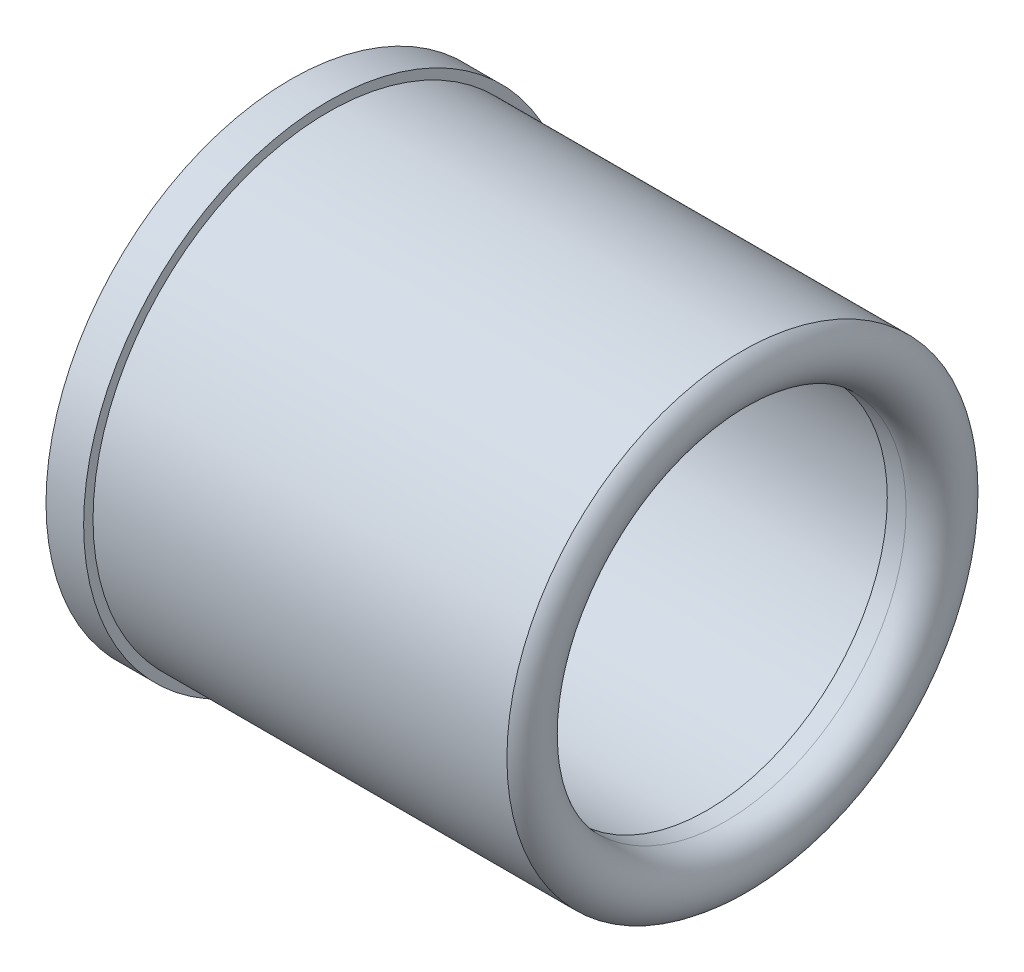
ISO-10303-21;
HEADER;
FILE_DESCRIPTION(('STEP AP214'),'2;1');
FILE_NAME('part.step','',(''),(''),'','','');
FILE_SCHEMA(('AUTOMOTIVE_DESIGN { 1 0 10303 214 1 1 1 1 }'));
ENDSEC;
DATA;
#1=APPLICATION_CONTEXT('core data for automotive mechanical design processes');
#2=APPLICATION_PROTOCOL_DEFINITION('international standard','automotive_design',2000,#1);
#3=PRODUCT_CONTEXT('',#1,'mechanical');
#4=PRODUCT('Part','Part','',(#3));
#5=PRODUCT_RELATED_PRODUCT_CATEGORY('part','',(#4));
#6=PRODUCT_DEFINITION_FORMATION('','',#4);
#7=PRODUCT_DEFINITION_CONTEXT('part definition',#1,'design');
#8=PRODUCT_DEFINITION('design','',#6,#7);
#9=PRODUCT_DEFINITION_SHAPE('','',#8);
#10=(LENGTH_UNIT() NAMED_UNIT(*) SI_UNIT(.MILLI.,.METRE.));
#11=(NAMED_UNIT(*) PLANE_ANGLE_UNIT() SI_UNIT($,.RADIAN.));
#12=(NAMED_UNIT(*) SI_UNIT($,.STERADIAN.) SOLID_ANGLE_UNIT());
#13=UNCERTAINTY_MEASURE_WITH_UNIT(LENGTH_MEASURE(1.E-05),#10,'distance_accuracy_value','');
#14=(GEOMETRIC_REPRESENTATION_CONTEXT(3) GLOBAL_UNCERTAINTY_ASSIGNED_CONTEXT((#13)) GLOBAL_UNIT_ASSIGNED_CONTEXT((#10,
#11,#12)) REPRESENTATION_CONTEXT('',''));
#15=CARTESIAN_POINT('',(0.,0.,0.));
#16=DIRECTION('',(0.,0.,1.));
#17=DIRECTION('',(1.,0.,0.));
#18=AXIS2_PLACEMENT_3D('',#15,#16,#17);
#19=CARTESIAN_POINT('',(12.1757416936097,-8.53326323507829,0.));
#20=DIRECTION('',(-1.,0.,0.));
#21=DIRECTION('',(0.,0.,1.));
#22=AXIS2_PLACEMENT_3D('',#19,#20,#21);
#23=CYLINDRICAL_SURFACE('',#22,4.8);
#24=CARTESIAN_POINT('',(11.9728126653829,-8.53326323507829,0.));
#25=DIRECTION('',(-1.,0.,0.));
#26=DIRECTION('',(0.,0.,1.));
#27=AXIS2_PLACEMENT_3D('',#24,#25,#26);
#28=CIRCLE('',#27,4.8);
#29=CARTESIAN_POINT('',(11.9728126653829,-8.53326323507829,4.8));
#30=VERTEX_POINT('',#29);
#31=EDGE_CURVE('E10',#30,#30,#28,.T.);
#32=ORIENTED_EDGE('',*,*,#31,.T.);
#33=EDGE_LOOP('',(#32));
#34=FACE_BOUND('',#33,.T.);
#35=CARTESIAN_POINT('',(12.4728126653829,-8.53326323507829,0.));
#36=DIRECTION('',(-1.,0.,0.));
#37=DIRECTION('',(0.,0.,1.));
#38=AXIS2_PLACEMENT_3D('',#35,#36,#37);
#39=CIRCLE('',#38,4.8);
#40=CARTESIAN_POINT('',(12.4728126653829,-8.53326323507829,4.8));
#41=VERTEX_POINT('',#40);
#42=EDGE_CURVE('E61',#41,#41,#39,.T.);
#43=ORIENTED_EDGE('',*,*,#42,.F.);
#44=EDGE_LOOP('',(#43));
#45=FACE_BOUND('',#44,.T.);
#46=ADVANCED_FACE('F33',(#34,#45),#23,.F.);
#47=CARTESIAN_POINT('',(11.9728126653829,-3.73326323507829,0.));
#48=DIRECTION('',(-1.,0.,0.));
#49=DIRECTION('',(0.,0.,1.));
#50=AXIS2_PLACEMENT_3D('',#47,#48,#49);
#51=PLANE('',#50);
#52=CARTESIAN_POINT('',(11.9728126653829,-8.53326323507829,0.));
#53=DIRECTION('',(-1.,0.,0.));
#54=DIRECTION('',(0.,0.,1.));
#55=AXIS2_PLACEMENT_3D('',#52,#53,#54);
#56=CIRCLE('',#55,5.05);
#57=CARTESIAN_POINT('',(11.9728126653829,-8.53326323507829,5.05));
#58=VERTEX_POINT('',#57);
#59=EDGE_CURVE('E39',#58,#58,#56,.T.);
#60=ORIENTED_EDGE('',*,*,#59,.T.);
#61=EDGE_LOOP('',(#60));
#62=FACE_BOUND('',#61,.T.);
#63=ORIENTED_EDGE('',*,*,#31,.F.);
#64=EDGE_LOOP('',(#63));
#65=FACE_BOUND('',#64,.T.);
#66=ADVANCED_FACE('F69',(#62,#65),#51,.T.);
#67=CARTESIAN_POINT('',(12.1757416936097,-8.53326323507829,0.));
#68=DIRECTION('',(-1.,0.,0.));
#69=DIRECTION('',(0.,0.,1.));
#70=AXIS2_PLACEMENT_3D('',#67,#68,#69);
#71=CYLINDRICAL_SURFACE('',#70,5.05);
#72=CARTESIAN_POINT('',(0.912123334161097,-8.53326323507829,0.));
#73=DIRECTION('',(-1.,0.,0.));
#74=DIRECTION('',(0.,0.,1.));
#75=AXIS2_PLACEMENT_3D('',#72,#73,#74);
#76=CIRCLE('',#75,5.05);
#77=CARTESIAN_POINT('',(0.912123334161097,-8.53326323507829,5.05));
#78=VERTEX_POINT('',#77);
#79=EDGE_CURVE('E43',#78,#78,#76,.T.);
#80=ORIENTED_EDGE('',*,*,#79,.T.);
#81=EDGE_LOOP('',(#80));
#82=FACE_BOUND('',#81,.T.);
#83=ORIENTED_EDGE('',*,*,#59,.F.);
#84=EDGE_LOOP('',(#83));
#85=FACE_BOUND('',#84,.T.);
#86=ADVANCED_FACE('F73',(#82,#85),#71,.F.);
#87=CARTESIAN_POINT('',(0.912123334161096,-3.48326323507829,0.));
#88=DIRECTION('',(-1.,0.,0.));
#89=DIRECTION('',(0.,0.,1.));
#90=AXIS2_PLACEMENT_3D('',#87,#88,#89);
#91=PLANE('',#90);
#92=CARTESIAN_POINT('',(0.912123334161097,-8.53326323507829,0.));
#93=DIRECTION('',(-1.,0.,0.));
#94=DIRECTION('',(0.,0.,1.));
#95=AXIS2_PLACEMENT_3D('',#92,#93,#94);
#96=CIRCLE('',#95,6.5);
#97=CARTESIAN_POINT('',(0.912123334161097,-8.53326323507829,6.5));
#98=VERTEX_POINT('',#97);
#99=EDGE_CURVE('E47',#98,#98,#96,.T.);
#100=ORIENTED_EDGE('',*,*,#99,.T.);
#101=EDGE_LOOP('',(#100));
#102=FACE_BOUND('',#101,.T.);
#103=ORIENTED_EDGE('',*,*,#79,.F.);
#104=EDGE_LOOP('',(#103));
#105=FACE_BOUND('',#104,.T.);
#106=ADVANCED_FACE('F77',(#102,#105),#91,.T.);
#107=CARTESIAN_POINT('',(12.1757416936097,-8.53326323507829,0.));
#108=DIRECTION('',(-1.,0.,0.));
#109=DIRECTION('',(0.,0.,1.));
#110=AXIS2_PLACEMENT_3D('',#107,#108,#109);
#111=CYLINDRICAL_SURFACE('',#110,6.5);
#112=CARTESIAN_POINT('',(1.9121233341611,-8.53326323507829,0.));
#113=DIRECTION('',(-1.,0.,0.));
#114=DIRECTION('',(0.,0.,1.));
#115=AXIS2_PLACEMENT_3D('',#112,#113,#114);
#116=CIRCLE('',#115,6.5);
#117=CARTESIAN_POINT('',(1.9121233341611,-8.53326323507829,6.5));
#118=VERTEX_POINT('',#117);
#119=EDGE_CURVE('E52',#118,#118,#116,.T.);
#120=ORIENTED_EDGE('',*,*,#119,.T.);
#121=EDGE_LOOP('',(#120));
#122=FACE_BOUND('',#121,.T.);
#123=ORIENTED_EDGE('',*,*,#99,.F.);
#124=EDGE_LOOP('',(#123));
#125=FACE_BOUND('',#124,.T.);
#126=ADVANCED_FACE('F84',(#122,#125),#111,.T.);
#127=CARTESIAN_POINT('',(1.9121233341611,-2.0332632350783,0.));
#128=DIRECTION('',(1.,0.,0.));
#129=DIRECTION('',(0.,0.,-1.));
#130=AXIS2_PLACEMENT_3D('',#127,#128,#129);
#131=PLANE('',#130);
#132=CARTESIAN_POINT('',(1.9121233341611,-8.53326323507829,0.));
#133=DIRECTION('',(-1.,0.,0.));
#134=DIRECTION('',(0.,0.,1.));
#135=AXIS2_PLACEMENT_3D('',#132,#133,#134);
#136=CIRCLE('',#135,6.25);
#137=CARTESIAN_POINT('',(1.9121233341611,-8.53326323507829,6.25));
#138=VERTEX_POINT('',#137);
#139=EDGE_CURVE('E55',#138,#138,#136,.T.);
#140=ORIENTED_EDGE('',*,*,#139,.T.);
#141=EDGE_LOOP('',(#140));
#142=FACE_BOUND('',#141,.T.);
#143=ORIENTED_EDGE('',*,*,#119,.F.);
#144=EDGE_LOOP('',(#143));
#145=FACE_BOUND('',#144,.T.);
#146=ADVANCED_FACE('F88',(#142,#145),#131,.T.);
#147=CARTESIAN_POINT('',(12.1757416936097,-8.53326323507829,0.));
#148=DIRECTION('',(-1.,0.,0.));
#149=DIRECTION('',(0.,0.,1.));
#150=AXIS2_PLACEMENT_3D('',#147,#148,#149);
#151=CYLINDRICAL_SURFACE('',#150,6.25);
#152=CARTESIAN_POINT('',(12.9121233341611,-8.53326323507829,0.));
#153=DIRECTION('',(-1.,0.,0.));
#154=DIRECTION('',(0.,0.,1.));
#155=AXIS2_PLACEMENT_3D('',#152,#153,#154);
#156=CIRCLE('',#155,6.25);
#157=CARTESIAN_POINT('',(12.9121233341611,-8.53326323507829,6.25));
#158=VERTEX_POINT('',#157);
#159=EDGE_CURVE('E58',#158,#158,#156,.T.);
#160=ORIENTED_EDGE('',*,*,#159,.T.);
#161=EDGE_LOOP('',(#160));
#162=FACE_BOUND('',#161,.T.);
#163=ORIENTED_EDGE('',*,*,#139,.F.);
#164=EDGE_LOOP('',(#163));
#165=FACE_BOUND('',#164,.T.);
#166=ADVANCED_FACE('F92',(#162,#165),#151,.T.);
#167=CARTESIAN_POINT('',(12.4728126653829,-8.53326323507829,0.));
#168=DIRECTION('',(-1.,0.,0.));
#169=DIRECTION('',(0.,0.,1.));
#170=AXIS2_PLACEMENT_3D('',#167,#168,#169);
#171=TOROIDAL_SURFACE('',#170,5.59154960817322,0.791549608173223);
#172=ORIENTED_EDGE('',*,*,#42,.T.);
#173=EDGE_LOOP('',(#172));
#174=FACE_BOUND('',#173,.T.);
#175=ORIENTED_EDGE('',*,*,#159,.F.);
#176=EDGE_LOOP('',(#175));
#177=FACE_BOUND('',#176,.T.);
#178=ADVANCED_FACE('F65',(#174,#177),#171,.T.);
#179=CLOSED_SHELL('',(#46,#66,#86,#106,#126,#146,#166,#178));
#180=MANIFOLD_SOLID_BREP('B2',#179);
#181=ADVANCED_BREP_SHAPE_REPRESENTATION('',(#18,#180),#14);
#182=SHAPE_DEFINITION_REPRESENTATION(#9,#181);
ENDSEC;
END-ISO-10303-21;
